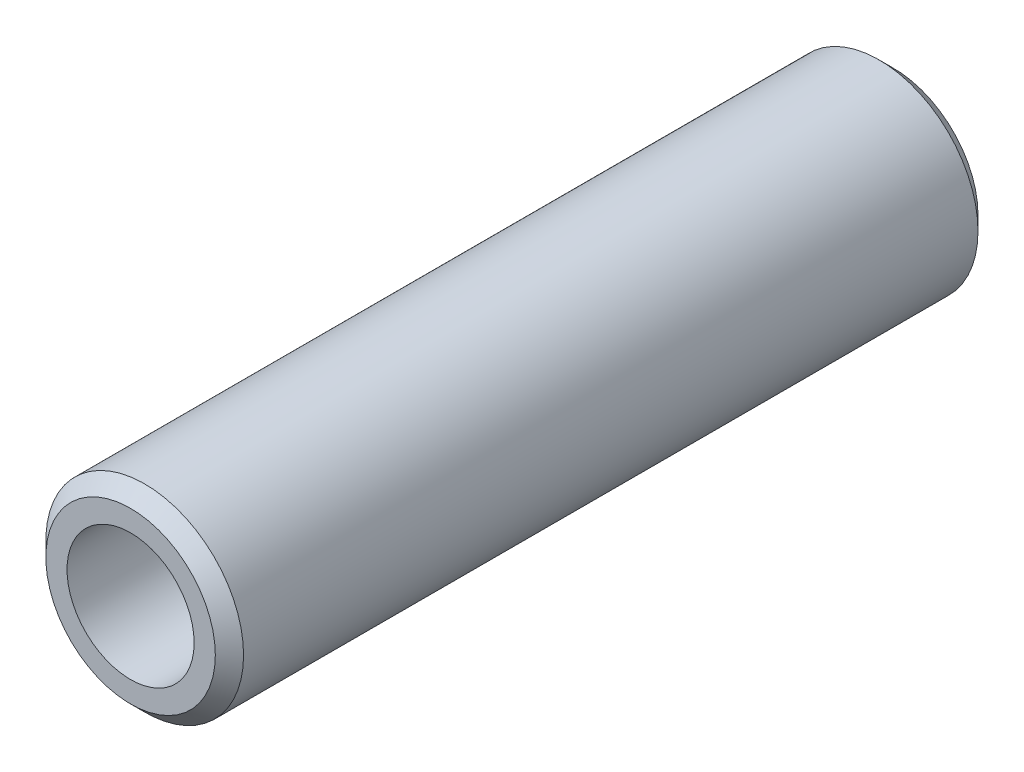
ISO-10303-21;
HEADER;
FILE_DESCRIPTION(('STEP AP214'),'2;1');
FILE_NAME('part.step','',(''),(''),'','','');
FILE_SCHEMA(('AUTOMOTIVE_DESIGN { 1 0 10303 214 1 1 1 1 }'));
ENDSEC;
DATA;
#1=APPLICATION_CONTEXT('core data for automotive mechanical design processes');
#2=APPLICATION_PROTOCOL_DEFINITION('international standard','automotive_design',2000,#1);
#3=PRODUCT_CONTEXT('',#1,'mechanical');
#4=PRODUCT('Part','Part','',(#3));
#5=PRODUCT_RELATED_PRODUCT_CATEGORY('part','',(#4));
#6=PRODUCT_DEFINITION_FORMATION('','',#4);
#7=PRODUCT_DEFINITION_CONTEXT('part definition',#1,'design');
#8=PRODUCT_DEFINITION('design','',#6,#7);
#9=PRODUCT_DEFINITION_SHAPE('','',#8);
#10=(LENGTH_UNIT() NAMED_UNIT(*) SI_UNIT(.MILLI.,.METRE.));
#11=(NAMED_UNIT(*) PLANE_ANGLE_UNIT() SI_UNIT($,.RADIAN.));
#12=(NAMED_UNIT(*) SI_UNIT($,.STERADIAN.) SOLID_ANGLE_UNIT());
#13=UNCERTAINTY_MEASURE_WITH_UNIT(LENGTH_MEASURE(1.E-05),#10,'distance_accuracy_value','');
#14=(GEOMETRIC_REPRESENTATION_CONTEXT(3) GLOBAL_UNCERTAINTY_ASSIGNED_CONTEXT((#13)) GLOBAL_UNIT_ASSIGNED_CONTEXT((#10,
#11,#12)) REPRESENTATION_CONTEXT('',''));
#15=CARTESIAN_POINT('',(0.,0.,0.));
#16=DIRECTION('',(0.,0.,1.));
#17=DIRECTION('',(1.,0.,0.));
#18=AXIS2_PLACEMENT_3D('',#15,#16,#17);
#19=CARTESIAN_POINT('',(0.,0.,135.));
#20=DIRECTION('',(0.,0.,1.));
#21=DIRECTION('',(1.,0.,0.));
#22=AXIS2_PLACEMENT_3D('',#19,#20,#21);
#23=PLANE('',#22);
#24=CARTESIAN_POINT('',(0.,0.,135.));
#25=DIRECTION('',(0.,0.,1.));
#26=DIRECTION('',(1.,0.,0.));
#27=AXIS2_PLACEMENT_3D('',#24,#25,#26);
#28=CIRCLE('',#27,30.);
#29=CARTESIAN_POINT('',(30.,0.,135.));
#30=VERTEX_POINT('',#29);
#31=EDGE_CURVE('E10',#30,#30,#28,.T.);
#32=ORIENTED_EDGE('',*,*,#31,.T.);
#33=EDGE_LOOP('',(#32));
#34=FACE_BOUND('',#33,.T.);
#35=CARTESIAN_POINT('',(0.,0.,135.));
#36=DIRECTION('',(0.,0.,1.));
#37=DIRECTION('',(1.,0.,0.));
#38=AXIS2_PLACEMENT_3D('',#35,#36,#37);
#39=CIRCLE('',#38,22.5);
#40=CARTESIAN_POINT('',(22.5,0.,135.));
#41=VERTEX_POINT('',#40);
#42=EDGE_CURVE('E64',#41,#41,#39,.T.);
#43=ORIENTED_EDGE('',*,*,#42,.F.);
#44=EDGE_LOOP('',(#43));
#45=FACE_BOUND('',#44,.T.);
#46=ADVANCED_FACE('F39',(#34,#45),#23,.T.);
#47=CARTESIAN_POINT('',(0.,0.,-135.));
#48=DIRECTION('',(0.,0.,1.));
#49=DIRECTION('',(1.,0.,0.));
#50=AXIS2_PLACEMENT_3D('',#47,#48,#49);
#51=PLANE('',#50);
#52=CARTESIAN_POINT('',(0.,0.,-135.));
#53=DIRECTION('',(0.,0.,1.));
#54=DIRECTION('',(1.,0.,0.));
#55=AXIS2_PLACEMENT_3D('',#52,#53,#54);
#56=CIRCLE('',#55,30.0000000000001);
#57=CARTESIAN_POINT('',(30.0000000000001,0.,-135.));
#58=VERTEX_POINT('',#57);
#59=EDGE_CURVE('E48',#58,#58,#56,.F.);
#60=ORIENTED_EDGE('',*,*,#59,.T.);
#61=EDGE_LOOP('',(#60));
#62=FACE_BOUND('',#61,.T.);
#63=CARTESIAN_POINT('',(0.,0.,-135.));
#64=DIRECTION('',(0.,0.,1.));
#65=DIRECTION('',(1.,0.,0.));
#66=AXIS2_PLACEMENT_3D('',#63,#64,#65);
#67=CIRCLE('',#66,22.5);
#68=CARTESIAN_POINT('',(22.5,0.,-135.));
#69=VERTEX_POINT('',#68);
#70=EDGE_CURVE('E65',#69,#69,#67,.T.);
#71=ORIENTED_EDGE('',*,*,#70,.T.);
#72=EDGE_LOOP('',(#71));
#73=FACE_BOUND('',#72,.T.);
#74=ADVANCED_FACE('F77',(#62,#73),#51,.F.);
#75=CARTESIAN_POINT('',(0.,0.,135.));
#76=DIRECTION('',(0.,0.,-1.));
#77=DIRECTION('',(-1.,0.,0.));
#78=AXIS2_PLACEMENT_3D('',#75,#76,#77);
#79=CYLINDRICAL_SURFACE('',#78,35.);
#80=CARTESIAN_POINT('',(0.,0.,-130.));
#81=DIRECTION('',(0.,0.,1.));
#82=DIRECTION('',(1.,0.,0.));
#83=AXIS2_PLACEMENT_3D('',#80,#81,#82);
#84=CIRCLE('',#83,35.);
#85=CARTESIAN_POINT('',(35.,0.,-130.));
#86=VERTEX_POINT('',#85);
#87=EDGE_CURVE('E53',#86,#86,#84,.T.);
#88=ORIENTED_EDGE('',*,*,#87,.T.);
#89=EDGE_LOOP('',(#88));
#90=FACE_BOUND('',#89,.T.);
#91=CARTESIAN_POINT('',(0.,0.,130.));
#92=DIRECTION('',(0.,0.,1.));
#93=DIRECTION('',(1.,0.,0.));
#94=AXIS2_PLACEMENT_3D('',#91,#92,#93);
#95=CIRCLE('',#94,35.);
#96=CARTESIAN_POINT('',(35.,0.,130.));
#97=VERTEX_POINT('',#96);
#98=EDGE_CURVE('E58',#97,#97,#95,.F.);
#99=ORIENTED_EDGE('',*,*,#98,.T.);
#100=EDGE_LOOP('',(#99));
#101=FACE_BOUND('',#100,.T.);
#102=ADVANCED_FACE('F82',(#90,#101),#79,.T.);
#103=CARTESIAN_POINT('',(0.,0.,135.));
#104=DIRECTION('',(0.,0.,-1.));
#105=DIRECTION('',(-1.,0.,0.));
#106=AXIS2_PLACEMENT_3D('',#103,#104,#105);
#107=CYLINDRICAL_SURFACE('',#106,22.5);
#108=ORIENTED_EDGE('',*,*,#42,.T.);
#109=EDGE_LOOP('',(#108));
#110=FACE_BOUND('',#109,.T.);
#111=ORIENTED_EDGE('',*,*,#70,.F.);
#112=EDGE_LOOP('',(#111));
#113=FACE_BOUND('',#112,.T.);
#114=ADVANCED_FACE('F73',(#110,#113),#107,.F.);
#115=CARTESIAN_POINT('',(0.,0.,-130.));
#116=DIRECTION('',(0.,0.,1.));
#117=DIRECTION('',(1.,0.,0.));
#118=AXIS2_PLACEMENT_3D('',#115,#116,#117);
#119=CONICAL_SURFACE('',#118,35.,0.785398163397454);
#120=ORIENTED_EDGE('',*,*,#59,.F.);
#121=EDGE_LOOP('',(#120));
#122=FACE_BOUND('',#121,.T.);
#123=ORIENTED_EDGE('',*,*,#87,.F.);
#124=EDGE_LOOP('',(#123));
#125=FACE_BOUND('',#124,.T.);
#126=ADVANCED_FACE('F89',(#122,#125),#119,.T.);
#127=CARTESIAN_POINT('',(0.,0.,135.));
#128=DIRECTION('',(0.,0.,-1.));
#129=DIRECTION('',(-1.,0.,0.));
#130=AXIS2_PLACEMENT_3D('',#127,#128,#129);
#131=CONICAL_SURFACE('',#130,30.,0.785398163397446);
#132=ORIENTED_EDGE('',*,*,#98,.F.);
#133=EDGE_LOOP('',(#132));
#134=FACE_BOUND('',#133,.T.);
#135=ORIENTED_EDGE('',*,*,#31,.F.);
#136=EDGE_LOOP('',(#135));
#137=FACE_BOUND('',#136,.T.);
#138=ADVANCED_FACE('F42',(#134,#137),#131,.T.);
#139=CLOSED_SHELL('',(#46,#74,#102,#114,#126,#138));
#140=MANIFOLD_SOLID_BREP('B2',#139);
#141=ADVANCED_BREP_SHAPE_REPRESENTATION('',(#18,#140),#14);
#142=SHAPE_DEFINITION_REPRESENTATION(#9,#141);
ENDSEC;
END-ISO-10303-21;
